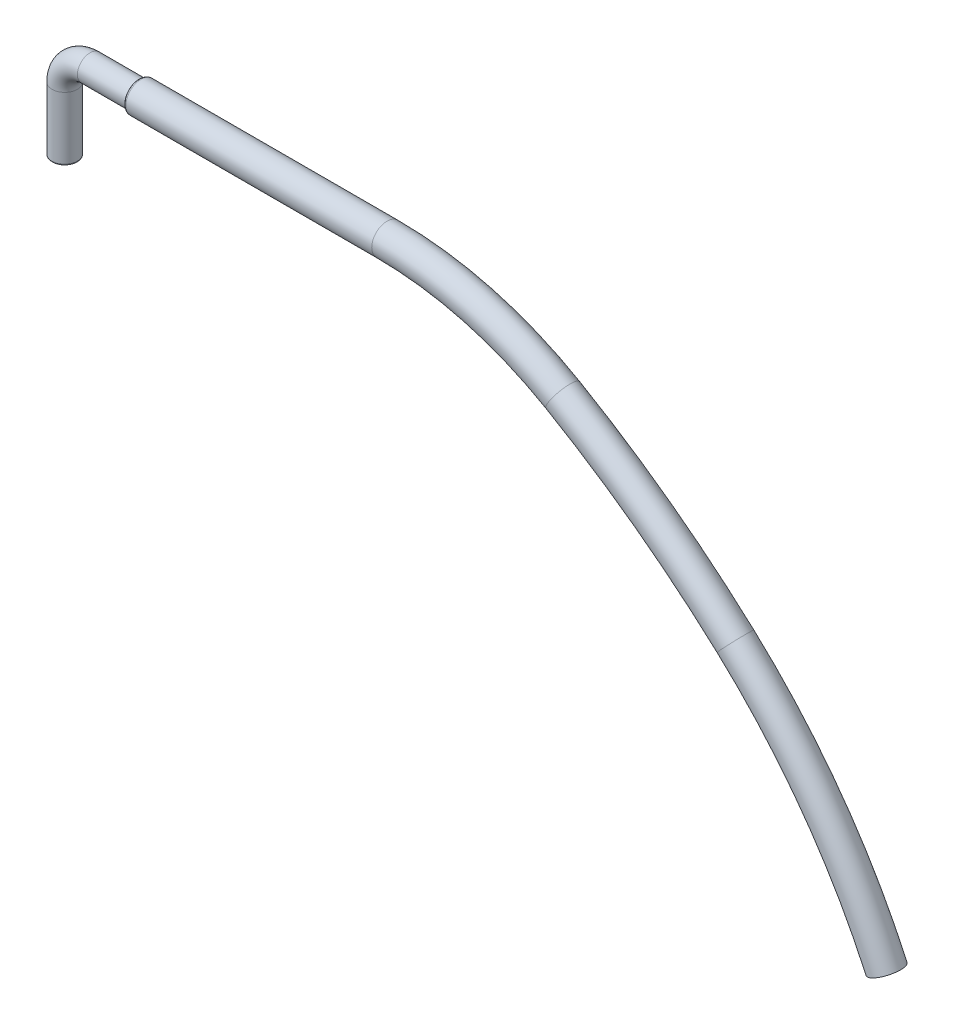
ISO-10303-21;
HEADER;
FILE_DESCRIPTION(('STEP AP214'),'2;1');
FILE_NAME('part.step','',(''),(''),'','','');
FILE_SCHEMA(('AUTOMOTIVE_DESIGN { 1 0 10303 214 1 1 1 1 }'));
ENDSEC;
DATA;
#1=APPLICATION_CONTEXT('core data for automotive mechanical design processes');
#2=APPLICATION_PROTOCOL_DEFINITION('international standard','automotive_design',2000,#1);
#3=PRODUCT_CONTEXT('',#1,'mechanical');
#4=PRODUCT('Part','Part','',(#3));
#5=PRODUCT_RELATED_PRODUCT_CATEGORY('part','',(#4));
#6=PRODUCT_DEFINITION_FORMATION('','',#4);
#7=PRODUCT_DEFINITION_CONTEXT('part definition',#1,'design');
#8=PRODUCT_DEFINITION('design','',#6,#7);
#9=PRODUCT_DEFINITION_SHAPE('','',#8);
#10=(LENGTH_UNIT() NAMED_UNIT(*) SI_UNIT(.MILLI.,.METRE.));
#11=(NAMED_UNIT(*) PLANE_ANGLE_UNIT() SI_UNIT($,.RADIAN.));
#12=(NAMED_UNIT(*) SI_UNIT($,.STERADIAN.) SOLID_ANGLE_UNIT());
#13=UNCERTAINTY_MEASURE_WITH_UNIT(LENGTH_MEASURE(1.E-05),#10,'distance_accuracy_value','');
#14=(GEOMETRIC_REPRESENTATION_CONTEXT(3) GLOBAL_UNCERTAINTY_ASSIGNED_CONTEXT((#13)) GLOBAL_UNIT_ASSIGNED_CONTEXT((#10,
#11,#12)) REPRESENTATION_CONTEXT('',''));
#15=CARTESIAN_POINT('',(0.,0.,0.));
#16=DIRECTION('',(0.,0.,1.));
#17=DIRECTION('',(1.,0.,0.));
#18=AXIS2_PLACEMENT_3D('',#15,#16,#17);
#19=CARTESIAN_POINT('',(92.2310294464062,-256.070124249139,0.));
#20=DIRECTION('',(0.,0.,-1.));
#21=DIRECTION('',(-1.,0.,0.));
#22=AXIS2_PLACEMENT_3D('',#19,#20,#21);
#23=TOROIDAL_SURFACE('',#22,254.383855683603,6.);
#24=CARTESIAN_POINT('',(264.25231202688,-68.6672844312081,0.));
#25=DIRECTION('',(0.736693133745949,-0.676227200496677,0.));
#26=DIRECTION('',(0.,0.,-1.));
#27=AXIS2_PLACEMENT_3D('',#24,#25,#26);
#28=CIRCLE('',#27,6.);
#29=CARTESIAN_POINT('',(268.30967522986,-64.2471256287324,0.));
#30=VERTEX_POINT('',#29);
#31=EDGE_CURVE('E54',#30,#30,#28,.T.);
#32=CARTESIAN_POINT('',(323.794410472072,-150.763208045034,0.));
#33=DIRECTION('',(0.413968551271126,-0.910291183390505,0.));
#34=DIRECTION('',(0.,0.,-1.));
#35=AXIS2_PLACEMENT_3D('',#32,#33,#34);
#36=CIRCLE('',#35,6.);
#37=CARTESIAN_POINT('',(329.256157572415,-148.279396737408,0.));
#38=VERTEX_POINT('',#37);
#39=EDGE_CURVE('E50',#38,#38,#36,.T.);
#40=CARTESIAN_POINT('',(92.2310294464062,-256.070124249139,0.));
#41=DIRECTION('',(0.,0.,-1.));
#42=DIRECTION('',(-1.,0.,0.));
#43=AXIS2_PLACEMENT_3D('',#40,#41,#42);
#44=CIRCLE('',#43,260.383855683603);
#45=EDGE_CURVE('',#30,#38,#44,.T.);
#46=ORIENTED_EDGE('',*,*,#31,.T.);
#47=ORIENTED_EDGE('',*,*,#39,.F.);
#48=ORIENTED_EDGE('',*,*,#45,.T.);
#49=ORIENTED_EDGE('',*,*,#45,.F.);
#50=EDGE_LOOP('',(#46,#48,#47,#49));
#51=FACE_BOUND('',#50,.T.);
#52=ADVANCED_FACE('F39',(#51),#23,.T.);
#53=CARTESIAN_POINT('',(0.863510446050597,-355.607415629206,0.));
#54=DIRECTION('',(0.,0.,-1.));
#55=DIRECTION('',(-1.,0.,0.));
#56=AXIS2_PLACEMENT_3D('',#53,#54,#55);
#57=TOROIDAL_SURFACE('',#56,389.497496384906,6.);
#58=CARTESIAN_POINT('',(196.139760017606,-18.5977925568416,0.));
#59=DIRECTION('',(0.865242077806137,-0.501354312631016,0.));
#60=DIRECTION('',(0.,0.,-1.));
#61=AXIS2_PLACEMENT_3D('',#58,#59,#60);
#62=CIRCLE('',#61,6.);
#63=CARTESIAN_POINT('',(199.147885893392,-13.4063400900048,0.));
#64=VERTEX_POINT('',#63);
#65=EDGE_CURVE('E59',#64,#64,#62,.T.);
#66=CARTESIAN_POINT('',(0.863510446050597,-355.607415629206,0.));
#67=DIRECTION('',(0.,0.,-1.));
#68=DIRECTION('',(-1.,0.,0.));
#69=AXIS2_PLACEMENT_3D('',#66,#67,#68);
#70=CIRCLE('',#69,395.497496384906);
#71=EDGE_CURVE('',#64,#30,#70,.T.);
#72=ORIENTED_EDGE('',*,*,#65,.T.);
#73=ORIENTED_EDGE('',*,*,#31,.F.);
#74=ORIENTED_EDGE('',*,*,#71,.T.);
#75=ORIENTED_EDGE('',*,*,#71,.F.);
#76=EDGE_LOOP('',(#72,#74,#73,#75));
#77=FACE_BOUND('',#76,.T.);
#78=ADVANCED_FACE('F98',(#77),#57,.T.);
#79=CARTESIAN_POINT('',(126.948403012443,-138.008899618435,0.));
#80=DIRECTION('',(0.,0.,-1.));
#81=DIRECTION('',(-1.,0.,0.));
#82=AXIS2_PLACEMENT_3D('',#79,#80,#81);
#83=TOROIDAL_SURFACE('',#82,138.008899618435,6.);
#84=CARTESIAN_POINT('',(126.948403012443,0.,0.));
#85=DIRECTION('',(1.,0.,0.));
#86=DIRECTION('',(0.,0.,-1.));
#87=AXIS2_PLACEMENT_3D('',#84,#85,#86);
#88=CIRCLE('',#87,6.);
#89=CARTESIAN_POINT('',(126.948403012443,6.00000000000001,0.));
#90=VERTEX_POINT('',#89);
#91=EDGE_CURVE('E62',#90,#90,#88,.T.);
#92=CARTESIAN_POINT('',(126.948403012443,-138.008899618435,0.));
#93=DIRECTION('',(0.,0.,-1.));
#94=DIRECTION('',(-1.,0.,0.));
#95=AXIS2_PLACEMENT_3D('',#92,#93,#94);
#96=CIRCLE('',#95,144.008899618435);
#97=EDGE_CURVE('',#90,#64,#96,.T.);
#98=ORIENTED_EDGE('',*,*,#91,.T.);
#99=ORIENTED_EDGE('',*,*,#65,.F.);
#100=ORIENTED_EDGE('',*,*,#97,.T.);
#101=ORIENTED_EDGE('',*,*,#97,.F.);
#102=EDGE_LOOP('',(#98,#100,#99,#101));
#103=FACE_BOUND('',#102,.T.);
#104=ADVANCED_FACE('F103',(#103),#83,.T.);
#105=CARTESIAN_POINT('',(126.948403012443,0.,0.));
#106=DIRECTION('',(-1.,0.,0.));
#107=DIRECTION('',(0.,0.,1.));
#108=AXIS2_PLACEMENT_3D('',#105,#106,#107);
#109=CYLINDRICAL_SURFACE('',#108,6.);
#110=CARTESIAN_POINT('',(30.0946378271993,0.,0.));
#111=DIRECTION('',(1.,0.,0.));
#112=DIRECTION('',(0.,0.,-1.));
#113=AXIS2_PLACEMENT_3D('',#110,#111,#112);
#114=CIRCLE('',#113,6.);
#115=CARTESIAN_POINT('',(30.0946378271993,0.,-6.));
#116=VERTEX_POINT('',#115);
#117=EDGE_CURVE('E46',#116,#116,#114,.T.);
#118=ORIENTED_EDGE('',*,*,#117,.T.);
#119=EDGE_LOOP('',(#118));
#120=FACE_BOUND('',#119,.T.);
#121=ORIENTED_EDGE('',*,*,#91,.F.);
#122=EDGE_LOOP('',(#121));
#123=FACE_BOUND('',#122,.T.);
#124=ADVANCED_FACE('F93',(#120,#123),#109,.T.);
#125=CARTESIAN_POINT('',(323.794410472072,-150.763208045034,0.));
#126=DIRECTION('',(0.413968551271126,-0.910291183390505,0.));
#127=DIRECTION('',(0.,0.,-1.));
#128=AXIS2_PLACEMENT_3D('',#125,#126,#127);
#129=PLANE('',#128);
#130=CARTESIAN_POINT('',(323.794410472072,-150.763208045035,0.));
#131=DIRECTION('',(0.413968551271126,-0.910291183390505,0.));
#132=DIRECTION('',(0.910291183390505,0.413968551271126,0.));
#133=AXIS2_PLACEMENT_3D('',#130,#131,#132);
#134=CIRCLE('',#133,2.);
#135=CARTESIAN_POINT('',(325.614992838853,-149.935270942492,0.));
#136=VERTEX_POINT('',#135);
#137=EDGE_CURVE('E65',#136,#136,#134,.T.);
#138=ORIENTED_EDGE('',*,*,#137,.F.);
#139=EDGE_LOOP('',(#138));
#140=FACE_BOUND('',#139,.T.);
#141=ORIENTED_EDGE('',*,*,#39,.T.);
#142=EDGE_LOOP('',(#141));
#143=FACE_BOUND('',#142,.T.);
#144=ADVANCED_FACE('F90',(#140,#143),#129,.T.);
#145=CARTESIAN_POINT('',(29.0946378271993,0.,0.));
#146=DIRECTION('',(1.,0.,0.));
#147=DIRECTION('',(0.,0.,-1.));
#148=AXIS2_PLACEMENT_3D('',#145,#146,#147);
#149=PLANE('',#148);
#150=CARTESIAN_POINT('',(29.0946378271993,0.,0.));
#151=DIRECTION('',(1.,0.,0.));
#152=DIRECTION('',(0.,0.,-1.));
#153=AXIS2_PLACEMENT_3D('',#150,#151,#152);
#154=CIRCLE('',#153,5.);
#155=CARTESIAN_POINT('',(29.0946378271993,0.,-5.));
#156=VERTEX_POINT('',#155);
#157=EDGE_CURVE('E11',#156,#156,#154,.F.);
#158=ORIENTED_EDGE('',*,*,#157,.T.);
#159=EDGE_LOOP('',(#158));
#160=FACE_BOUND('',#159,.T.);
#161=CARTESIAN_POINT('',(29.0946378271993,0.,0.));
#162=DIRECTION('',(1.,0.,0.));
#163=DIRECTION('',(0.,0.,-1.));
#164=AXIS2_PLACEMENT_3D('',#161,#162,#163);
#165=CIRCLE('',#164,2.);
#166=CARTESIAN_POINT('',(29.0946378271993,0.,-2.));
#167=VERTEX_POINT('',#166);
#168=EDGE_CURVE('E66',#167,#167,#165,.T.);
#169=ORIENTED_EDGE('',*,*,#168,.T.);
#170=EDGE_LOOP('',(#169));
#171=FACE_BOUND('',#170,.T.);
#172=ADVANCED_FACE('F86',(#160,#171),#149,.F.);
#173=CARTESIAN_POINT('',(92.2310294464062,-256.070124249139,0.));
#174=DIRECTION('',(0.,0.,-1.));
#175=DIRECTION('',(-1.,0.,0.));
#176=AXIS2_PLACEMENT_3D('',#173,#174,#175);
#177=TOROIDAL_SURFACE('',#176,254.383855683603,2.);
#178=CARTESIAN_POINT('',(264.25231202688,-68.6672844312081,0.));
#179=DIRECTION('',(-0.736693133745949,0.676227200496677,0.));
#180=DIRECTION('',(-0.676227200496677,-0.736693133745949,0.));
#181=AXIS2_PLACEMENT_3D('',#178,#179,#180);
#182=CIRCLE('',#181,2.);
#183=CARTESIAN_POINT('',(265.604766427873,-67.1938981637162,0.));
#184=VERTEX_POINT('',#183);
#185=EDGE_CURVE('E72',#184,#184,#182,.F.);
#186=CARTESIAN_POINT('',(92.2310294464062,-256.070124249139,0.));
#187=DIRECTION('',(0.,0.,-1.));
#188=DIRECTION('',(-1.,0.,0.));
#189=AXIS2_PLACEMENT_3D('',#186,#187,#188);
#190=CIRCLE('',#189,256.383855683603);
#191=EDGE_CURVE('',#184,#136,#190,.T.);
#192=ORIENTED_EDGE('',*,*,#185,.F.);
#193=ORIENTED_EDGE('',*,*,#137,.T.);
#194=ORIENTED_EDGE('',*,*,#191,.T.);
#195=ORIENTED_EDGE('',*,*,#191,.F.);
#196=EDGE_LOOP('',(#192,#194,#193,#195));
#197=FACE_BOUND('',#196,.T.);
#198=ADVANCED_FACE('F83',(#197),#177,.F.);
#199=CARTESIAN_POINT('',(0.863510446050597,-355.607415629206,0.));
#200=DIRECTION('',(0.,0.,-1.));
#201=DIRECTION('',(-1.,0.,0.));
#202=AXIS2_PLACEMENT_3D('',#199,#200,#201);
#203=TOROIDAL_SURFACE('',#202,389.497496384906,2.);
#204=CARTESIAN_POINT('',(196.139760017606,-18.5977925568416,0.));
#205=DIRECTION('',(-0.865242077806138,0.501354312631015,0.));
#206=DIRECTION('',(-0.501354312631015,-0.865242077806138,0.));
#207=AXIS2_PLACEMENT_3D('',#204,#205,#206);
#208=CIRCLE('',#207,2.);
#209=CARTESIAN_POINT('',(197.142468642868,-16.8673084012294,0.));
#210=VERTEX_POINT('',#209);
#211=EDGE_CURVE('E75',#210,#210,#208,.F.);
#212=CARTESIAN_POINT('',(0.863510446050597,-355.607415629206,0.));
#213=DIRECTION('',(0.,0.,-1.));
#214=DIRECTION('',(-1.,0.,0.));
#215=AXIS2_PLACEMENT_3D('',#212,#213,#214);
#216=CIRCLE('',#215,391.497496384906);
#217=EDGE_CURVE('',#210,#184,#216,.T.);
#218=ORIENTED_EDGE('',*,*,#211,.F.);
#219=ORIENTED_EDGE('',*,*,#185,.T.);
#220=ORIENTED_EDGE('',*,*,#217,.T.);
#221=ORIENTED_EDGE('',*,*,#217,.F.);
#222=EDGE_LOOP('',(#218,#220,#219,#221));
#223=FACE_BOUND('',#222,.T.);
#224=ADVANCED_FACE('F81',(#223),#203,.F.);
#225=CARTESIAN_POINT('',(126.948403012443,-138.008899618435,0.));
#226=DIRECTION('',(0.,0.,-1.));
#227=DIRECTION('',(-1.,0.,0.));
#228=AXIS2_PLACEMENT_3D('',#225,#226,#227);
#229=TOROIDAL_SURFACE('',#228,138.008899618435,2.);
#230=CARTESIAN_POINT('',(126.948403012443,0.,0.));
#231=DIRECTION('',(-1.,0.,0.));
#232=DIRECTION('',(0.,-1.,0.));
#233=AXIS2_PLACEMENT_3D('',#230,#231,#232);
#234=CIRCLE('',#233,2.);
#235=CARTESIAN_POINT('',(126.948403012443,2.,0.));
#236=VERTEX_POINT('',#235);
#237=EDGE_CURVE('E69',#236,#236,#234,.F.);
#238=CARTESIAN_POINT('',(126.948403012443,-138.008899618435,0.));
#239=DIRECTION('',(0.,0.,-1.));
#240=DIRECTION('',(-1.,0.,0.));
#241=AXIS2_PLACEMENT_3D('',#238,#239,#240);
#242=CIRCLE('',#241,140.008899618435);
#243=EDGE_CURVE('',#236,#210,#242,.T.);
#244=ORIENTED_EDGE('',*,*,#237,.F.);
#245=ORIENTED_EDGE('',*,*,#211,.T.);
#246=ORIENTED_EDGE('',*,*,#243,.T.);
#247=ORIENTED_EDGE('',*,*,#243,.F.);
#248=EDGE_LOOP('',(#244,#246,#245,#247));
#249=FACE_BOUND('',#248,.T.);
#250=ADVANCED_FACE('F117',(#249),#229,.F.);
#251=CARTESIAN_POINT('',(126.948403012443,0.,0.));
#252=DIRECTION('',(-1.,0.,0.));
#253=DIRECTION('',(0.,0.,1.));
#254=AXIS2_PLACEMENT_3D('',#251,#252,#253);
#255=CYLINDRICAL_SURFACE('',#254,2.);
#256=ORIENTED_EDGE('',*,*,#237,.T.);
#257=EDGE_LOOP('',(#256));
#258=FACE_BOUND('',#257,.T.);
#259=ORIENTED_EDGE('',*,*,#168,.F.);
#260=EDGE_LOOP('',(#259));
#261=FACE_BOUND('',#260,.T.);
#262=ADVANCED_FACE('F114',(#258,#261),#255,.F.);
#263=CARTESIAN_POINT('',(30.0946378271993,0.,0.));
#264=DIRECTION('',(1.,0.,0.));
#265=DIRECTION('',(0.,0.,-1.));
#266=AXIS2_PLACEMENT_3D('',#263,#264,#265);
#267=TOROIDAL_SURFACE('',#266,5.,1.);
#268=ORIENTED_EDGE('',*,*,#157,.F.);
#269=EDGE_LOOP('',(#268));
#270=FACE_BOUND('',#269,.T.);
#271=ORIENTED_EDGE('',*,*,#117,.F.);
#272=EDGE_LOOP('',(#271));
#273=FACE_BOUND('',#272,.T.);
#274=ADVANCED_FACE('F41',(#270,#273),#267,.T.);
#275=CLOSED_SHELL('',(#52,#78,#104,#124,#144,#172,#198,#224,#250,#262,#274));
#276=MANIFOLD_SOLID_BREP('B2',#275);
#277=CARTESIAN_POINT('',(10.,0.,0.));
#278=DIRECTION('',(1.,0.,0.));
#279=DIRECTION('',(0.,1.,0.));
#280=AXIS2_PLACEMENT_3D('',#277,#278,#279);
#281=CYLINDRICAL_SURFACE('',#280,5.);
#282=CARTESIAN_POINT('',(49.5,0.,0.));
#283=DIRECTION('',(-1.,0.,0.));
#284=DIRECTION('',(0.,-1.,0.));
#285=AXIS2_PLACEMENT_3D('',#282,#283,#284);
#286=CIRCLE('',#285,5.);
#287=CARTESIAN_POINT('',(49.5,-5.,0.));
#288=VERTEX_POINT('',#287);
#289=EDGE_CURVE('E221',#288,#288,#286,.T.);
#290=ORIENTED_EDGE('',*,*,#289,.T.);
#291=EDGE_LOOP('',(#290));
#292=FACE_BOUND('',#291,.T.);
#293=CARTESIAN_POINT('',(10.,0.,0.));
#294=DIRECTION('',(-1.,0.,0.));
#295=DIRECTION('',(0.,-1.,0.));
#296=AXIS2_PLACEMENT_3D('',#293,#294,#295);
#297=CIRCLE('',#296,5.);
#298=CARTESIAN_POINT('',(10.,5.,0.));
#299=VERTEX_POINT('',#298);
#300=EDGE_CURVE('E238',#299,#299,#297,.T.);
#301=ORIENTED_EDGE('',*,*,#300,.F.);
#302=EDGE_LOOP('',(#301));
#303=FACE_BOUND('',#302,.T.);
#304=ADVANCED_FACE('F206',(#292,#303),#281,.T.);
#305=CARTESIAN_POINT('',(10.,-10.,0.));
#306=DIRECTION('',(0.,0.,-1.));
#307=DIRECTION('',(-1.,0.,0.));
#308=AXIS2_PLACEMENT_3D('',#305,#306,#307);
#309=TOROIDAL_SURFACE('',#308,10.,5.);
#310=CARTESIAN_POINT('',(0.,-10.,0.));
#311=DIRECTION('',(0.,-1.,0.));
#312=DIRECTION('',(1.,0.,0.));
#313=AXIS2_PLACEMENT_3D('',#310,#311,#312);
#314=CIRCLE('',#313,5.);
#315=CARTESIAN_POINT('',(-5.,-10.,0.));
#316=VERTEX_POINT('',#315);
#317=EDGE_CURVE('E241',#316,#316,#314,.T.);
#318=CARTESIAN_POINT('',(10.,-10.,0.));
#319=DIRECTION('',(0.,0.,-1.));
#320=DIRECTION('',(-1.,0.,0.));
#321=AXIS2_PLACEMENT_3D('',#318,#319,#320);
#322=CIRCLE('',#321,15.);
#323=EDGE_CURVE('',#316,#299,#322,.T.);
#324=ORIENTED_EDGE('',*,*,#317,.F.);
#325=ORIENTED_EDGE('',*,*,#300,.T.);
#326=ORIENTED_EDGE('',*,*,#323,.T.);
#327=ORIENTED_EDGE('',*,*,#323,.F.);
#328=EDGE_LOOP('',(#324,#326,#325,#327));
#329=FACE_BOUND('',#328,.T.);
#330=ADVANCED_FACE('F268',(#329),#309,.T.);
#331=CARTESIAN_POINT('',(0.,-10.,0.));
#332=DIRECTION('',(0.,-1.,0.));
#333=DIRECTION('',(1.,0.,0.));
#334=AXIS2_PLACEMENT_3D('',#331,#332,#333);
#335=CYLINDRICAL_SURFACE('',#334,5.);
#336=CARTESIAN_POINT('',(0.,-34.5,0.));
#337=DIRECTION('',(0.,-1.,0.));
#338=DIRECTION('',(1.,0.,0.));
#339=AXIS2_PLACEMENT_3D('',#336,#337,#338);
#340=CIRCLE('',#339,5.);
#341=CARTESIAN_POINT('',(5.,-34.5,0.));
#342=VERTEX_POINT('',#341);
#343=EDGE_CURVE('E226',#342,#342,#340,.F.);
#344=ORIENTED_EDGE('',*,*,#343,.T.);
#345=EDGE_LOOP('',(#344));
#346=FACE_BOUND('',#345,.T.);
#347=ORIENTED_EDGE('',*,*,#317,.T.);
#348=EDGE_LOOP('',(#347));
#349=FACE_BOUND('',#348,.T.);
#350=ADVANCED_FACE('F274',(#346,#349),#335,.T.);
#351=CARTESIAN_POINT('',(50.,0.,0.));
#352=DIRECTION('',(-1.,0.,0.));
#353=DIRECTION('',(0.,-1.,0.));
#354=AXIS2_PLACEMENT_3D('',#351,#352,#353);
#355=PLANE('',#354);
#356=CARTESIAN_POINT('',(50.,0.,0.));
#357=DIRECTION('',(-1.,0.,0.));
#358=DIRECTION('',(0.,-1.,0.));
#359=AXIS2_PLACEMENT_3D('',#356,#357,#358);
#360=CIRCLE('',#359,4.5);
#361=CARTESIAN_POINT('',(50.,-4.5,0.));
#362=VERTEX_POINT('',#361);
#363=EDGE_CURVE('E213',#362,#362,#360,.F.);
#364=ORIENTED_EDGE('',*,*,#363,.T.);
#365=EDGE_LOOP('',(#364));
#366=FACE_BOUND('',#365,.T.);
#367=CARTESIAN_POINT('',(50.,0.,0.));
#368=DIRECTION('',(-1.,0.,0.));
#369=DIRECTION('',(0.,-1.,0.));
#370=AXIS2_PLACEMENT_3D('',#367,#368,#369);
#371=CIRCLE('',#370,3.5);
#372=CARTESIAN_POINT('',(50.,-3.5,0.));
#373=VERTEX_POINT('',#372);
#374=EDGE_CURVE('E217',#373,#373,#371,.T.);
#375=ORIENTED_EDGE('',*,*,#374,.T.);
#376=EDGE_LOOP('',(#375));
#377=FACE_BOUND('',#376,.T.);
#378=ADVANCED_FACE('F300',(#366,#377),#355,.F.);
#379=CARTESIAN_POINT('',(0.,-35.,0.));
#380=DIRECTION('',(0.,-1.,0.));
#381=DIRECTION('',(1.,0.,0.));
#382=AXIS2_PLACEMENT_3D('',#379,#380,#381);
#383=PLANE('',#382);
#384=CARTESIAN_POINT('',(0.,-35.,0.));
#385=DIRECTION('',(0.,-1.,0.));
#386=DIRECTION('',(1.,0.,0.));
#387=AXIS2_PLACEMENT_3D('',#384,#385,#386);
#388=CIRCLE('',#387,3.5);
#389=CARTESIAN_POINT('',(3.5,-35.,0.));
#390=VERTEX_POINT('',#389);
#391=EDGE_CURVE('E229',#390,#390,#388,.F.);
#392=ORIENTED_EDGE('',*,*,#391,.T.);
#393=EDGE_LOOP('',(#392));
#394=FACE_BOUND('',#393,.T.);
#395=CARTESIAN_POINT('',(0.,-35.,0.));
#396=DIRECTION('',(0.,-1.,0.));
#397=DIRECTION('',(1.,0.,0.));
#398=AXIS2_PLACEMENT_3D('',#395,#396,#397);
#399=CIRCLE('',#398,4.5);
#400=CARTESIAN_POINT('',(4.5,-35.,0.));
#401=VERTEX_POINT('',#400);
#402=EDGE_CURVE('E232',#401,#401,#399,.T.);
#403=ORIENTED_EDGE('',*,*,#402,.T.);
#404=EDGE_LOOP('',(#403));
#405=FACE_BOUND('',#404,.T.);
#406=ADVANCED_FACE('F265',(#394,#405),#383,.T.);
#407=CARTESIAN_POINT('',(10.,0.,0.));
#408=DIRECTION('',(1.,0.,0.));
#409=DIRECTION('',(0.,1.,0.));
#410=AXIS2_PLACEMENT_3D('',#407,#408,#409);
#411=CYLINDRICAL_SURFACE('',#410,3.);
#412=CARTESIAN_POINT('',(49.5,0.,0.));
#413=DIRECTION('',(-1.,0.,0.));
#414=DIRECTION('',(0.,-1.,0.));
#415=AXIS2_PLACEMENT_3D('',#412,#413,#414);
#416=CIRCLE('',#415,3.);
#417=CARTESIAN_POINT('',(49.5,-3.,0.));
#418=VERTEX_POINT('',#417);
#419=EDGE_CURVE('E38',#418,#418,#416,.F.);
#420=ORIENTED_EDGE('',*,*,#419,.T.);
#421=EDGE_LOOP('',(#420));
#422=FACE_BOUND('',#421,.T.);
#423=CARTESIAN_POINT('',(10.,0.,0.));
#424=DIRECTION('',(-1.,0.,0.));
#425=DIRECTION('',(0.,-1.,0.));
#426=AXIS2_PLACEMENT_3D('',#423,#424,#425);
#427=CIRCLE('',#426,3.);
#428=CARTESIAN_POINT('',(10.,3.,0.));
#429=VERTEX_POINT('',#428);
#430=EDGE_CURVE('E244',#429,#429,#427,.T.);
#431=ORIENTED_EDGE('',*,*,#430,.T.);
#432=EDGE_LOOP('',(#431));
#433=FACE_BOUND('',#432,.T.);
#434=ADVANCED_FACE('F251',(#422,#433),#411,.F.);
#435=CARTESIAN_POINT('',(10.,-10.,0.));
#436=DIRECTION('',(0.,0.,-1.));
#437=DIRECTION('',(-1.,0.,0.));
#438=AXIS2_PLACEMENT_3D('',#435,#436,#437);
#439=TOROIDAL_SURFACE('',#438,10.,3.);
#440=CARTESIAN_POINT('',(0.,-10.,0.));
#441=DIRECTION('',(0.,-1.,0.));
#442=DIRECTION('',(1.,0.,0.));
#443=AXIS2_PLACEMENT_3D('',#440,#441,#442);
#444=CIRCLE('',#443,3.);
#445=CARTESIAN_POINT('',(-3.,-10.,0.));
#446=VERTEX_POINT('',#445);
#447=EDGE_CURVE('E245',#446,#446,#444,.T.);
#448=CARTESIAN_POINT('',(10.,-10.,0.));
#449=DIRECTION('',(0.,0.,-1.));
#450=DIRECTION('',(-1.,0.,0.));
#451=AXIS2_PLACEMENT_3D('',#448,#449,#450);
#452=CIRCLE('',#451,13.);
#453=EDGE_CURVE('',#446,#429,#452,.T.);
#454=ORIENTED_EDGE('',*,*,#447,.T.);
#455=ORIENTED_EDGE('',*,*,#430,.F.);
#456=ORIENTED_EDGE('',*,*,#453,.T.);
#457=ORIENTED_EDGE('',*,*,#453,.F.);
#458=EDGE_LOOP('',(#454,#456,#455,#457));
#459=FACE_BOUND('',#458,.T.);
#460=ADVANCED_FACE('F253',(#459),#439,.F.);
#461=CARTESIAN_POINT('',(0.,-10.,0.));
#462=DIRECTION('',(0.,-1.,0.));
#463=DIRECTION('',(1.,0.,0.));
#464=AXIS2_PLACEMENT_3D('',#461,#462,#463);
#465=CYLINDRICAL_SURFACE('',#464,3.);
#466=CARTESIAN_POINT('',(0.,-34.5,0.));
#467=DIRECTION('',(0.,-1.,0.));
#468=DIRECTION('',(1.,0.,0.));
#469=AXIS2_PLACEMENT_3D('',#466,#467,#468);
#470=CIRCLE('',#469,3.);
#471=CARTESIAN_POINT('',(3.,-34.5,0.));
#472=VERTEX_POINT('',#471);
#473=EDGE_CURVE('E235',#472,#472,#470,.T.);
#474=ORIENTED_EDGE('',*,*,#473,.T.);
#475=EDGE_LOOP('',(#474));
#476=FACE_BOUND('',#475,.T.);
#477=ORIENTED_EDGE('',*,*,#447,.F.);
#478=EDGE_LOOP('',(#477));
#479=FACE_BOUND('',#478,.T.);
#480=ADVANCED_FACE('F255',(#476,#479),#465,.F.);
#481=CARTESIAN_POINT('',(0.,-34.5,0.));
#482=DIRECTION('',(0.,-1.,0.));
#483=DIRECTION('',(1.,0.,0.));
#484=AXIS2_PLACEMENT_3D('',#481,#482,#483);
#485=TOROIDAL_SURFACE('',#484,3.5,0.5);
#486=ORIENTED_EDGE('',*,*,#391,.F.);
#487=EDGE_LOOP('',(#486));
#488=FACE_BOUND('',#487,.T.);
#489=ORIENTED_EDGE('',*,*,#473,.F.);
#490=EDGE_LOOP('',(#489));
#491=FACE_BOUND('',#490,.T.);
#492=ADVANCED_FACE('F262',(#488,#491),#485,.T.);
#493=CARTESIAN_POINT('',(0.,-34.5,0.));
#494=DIRECTION('',(0.,-1.,0.));
#495=DIRECTION('',(1.,0.,0.));
#496=AXIS2_PLACEMENT_3D('',#493,#494,#495);
#497=TOROIDAL_SURFACE('',#496,4.5,0.5);
#498=ORIENTED_EDGE('',*,*,#343,.F.);
#499=EDGE_LOOP('',(#498));
#500=FACE_BOUND('',#499,.T.);
#501=ORIENTED_EDGE('',*,*,#402,.F.);
#502=EDGE_LOOP('',(#501));
#503=FACE_BOUND('',#502,.T.);
#504=ADVANCED_FACE('F282',(#500,#503),#497,.T.);
#505=CARTESIAN_POINT('',(49.5,0.,0.));
#506=DIRECTION('',(-1.,0.,0.));
#507=DIRECTION('',(0.,-1.,0.));
#508=AXIS2_PLACEMENT_3D('',#505,#506,#507);
#509=TOROIDAL_SURFACE('',#508,4.5,0.5);
#510=ORIENTED_EDGE('',*,*,#363,.F.);
#511=EDGE_LOOP('',(#510));
#512=FACE_BOUND('',#511,.T.);
#513=ORIENTED_EDGE('',*,*,#289,.F.);
#514=EDGE_LOOP('',(#513));
#515=FACE_BOUND('',#514,.T.);
#516=ADVANCED_FACE('F285',(#512,#515),#509,.T.);
#517=CARTESIAN_POINT('',(49.5,0.,0.));
#518=DIRECTION('',(-1.,0.,0.));
#519=DIRECTION('',(0.,-1.,0.));
#520=AXIS2_PLACEMENT_3D('',#517,#518,#519);
#521=TOROIDAL_SURFACE('',#520,3.5,0.5);
#522=ORIENTED_EDGE('',*,*,#419,.F.);
#523=EDGE_LOOP('',(#522));
#524=FACE_BOUND('',#523,.T.);
#525=ORIENTED_EDGE('',*,*,#374,.F.);
#526=EDGE_LOOP('',(#525));
#527=FACE_BOUND('',#526,.T.);
#528=ADVANCED_FACE('F208',(#524,#527),#521,.T.);
#529=CLOSED_SHELL('',(#304,#330,#350,#378,#406,#434,#460,#480,#492,#504,#516,#528));
#530=MANIFOLD_SOLID_BREP('B6',#529);
#531=ADVANCED_BREP_SHAPE_REPRESENTATION('',(#18,#276,#530),#14);
#532=SHAPE_DEFINITION_REPRESENTATION(#9,#531);
ENDSEC;
END-ISO-10303-21;
